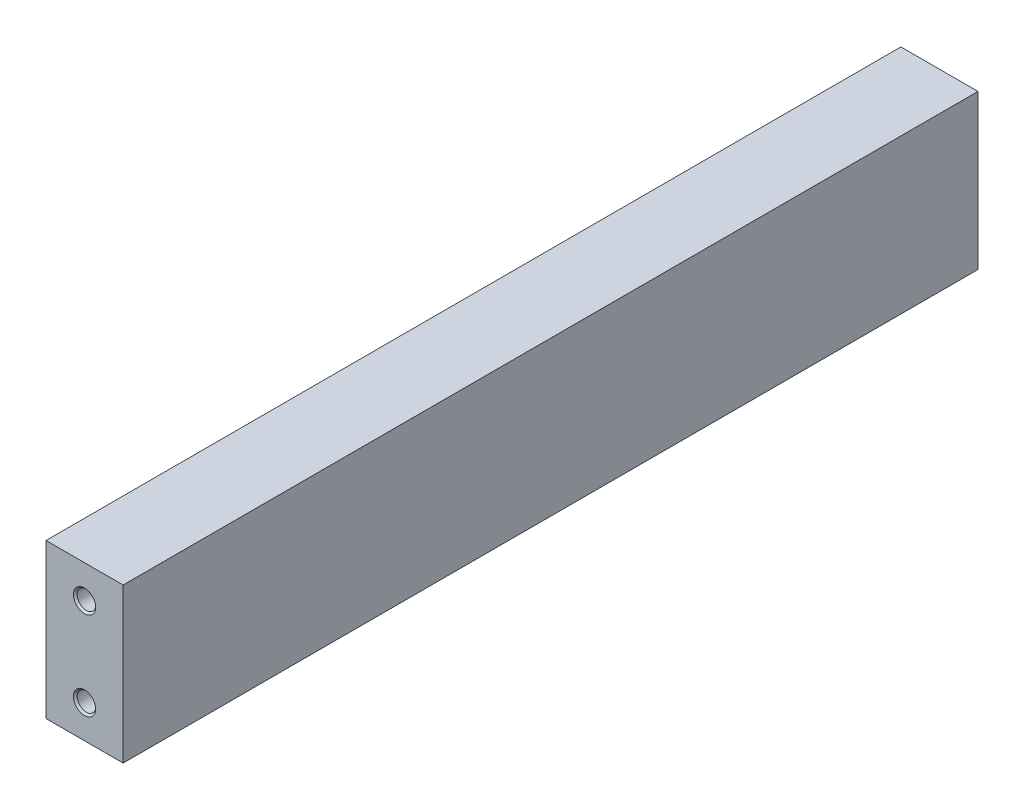
ISO-10303-21;
HEADER;
FILE_DESCRIPTION(('STEP AP214'),'2;1');
FILE_NAME('part.step','',(''),(''),'','','');
FILE_SCHEMA(('AUTOMOTIVE_DESIGN { 1 0 10303 214 1 1 1 1 }'));
ENDSEC;
DATA;
#1=APPLICATION_CONTEXT('core data for automotive mechanical design processes');
#2=APPLICATION_PROTOCOL_DEFINITION('international standard','automotive_design',2000,#1);
#3=PRODUCT_CONTEXT('',#1,'mechanical');
#4=PRODUCT('Part','Part','',(#3));
#5=PRODUCT_RELATED_PRODUCT_CATEGORY('part','',(#4));
#6=PRODUCT_DEFINITION_FORMATION('','',#4);
#7=PRODUCT_DEFINITION_CONTEXT('part definition',#1,'design');
#8=PRODUCT_DEFINITION('design','',#6,#7);
#9=PRODUCT_DEFINITION_SHAPE('','',#8);
#10=(LENGTH_UNIT() NAMED_UNIT(*) SI_UNIT(.MILLI.,.METRE.));
#11=(NAMED_UNIT(*) PLANE_ANGLE_UNIT() SI_UNIT($,.RADIAN.));
#12=(NAMED_UNIT(*) SI_UNIT($,.STERADIAN.) SOLID_ANGLE_UNIT());
#13=UNCERTAINTY_MEASURE_WITH_UNIT(LENGTH_MEASURE(1.E-05),#10,'distance_accuracy_value','');
#14=(GEOMETRIC_REPRESENTATION_CONTEXT(3) GLOBAL_UNCERTAINTY_ASSIGNED_CONTEXT((#13)) GLOBAL_UNIT_ASSIGNED_CONTEXT((#10,
#11,#12)) REPRESENTATION_CONTEXT('',''));
#15=CARTESIAN_POINT('',(0.,0.,0.));
#16=DIRECTION('',(0.,0.,1.));
#17=DIRECTION('',(1.,0.,0.));
#18=AXIS2_PLACEMENT_3D('',#15,#16,#17);
#19=CARTESIAN_POINT('',(8.75,-17.5,97.));
#20=DIRECTION('',(-1.,0.,0.));
#21=DIRECTION('',(0.,0.,1.));
#22=AXIS2_PLACEMENT_3D('',#19,#20,#21);
#23=PLANE('',#22);
#24=DIRECTION('',(0.,1.,0.));
#25=VECTOR('',#24,1.);
#26=CARTESIAN_POINT('',(8.75,-17.5,-97.));
#27=LINE('',#26,#25);
#28=CARTESIAN_POINT('',(8.75,-17.5,-97.));
#29=VERTEX_POINT('',#28);
#30=CARTESIAN_POINT('',(8.75,17.5,-97.));
#31=VERTEX_POINT('',#30);
#32=EDGE_CURVE('E161',#29,#31,#27,.T.);
#33=ORIENTED_EDGE('',*,*,#32,.T.);
#34=DIRECTION('',(0.,0.,-1.));
#35=VECTOR('',#34,1.);
#36=CARTESIAN_POINT('',(8.75,17.5,97.));
#37=LINE('',#36,#35);
#38=CARTESIAN_POINT('',(8.75,17.5,97.));
#39=VERTEX_POINT('',#38);
#40=EDGE_CURVE('E11',#39,#31,#37,.T.);
#41=ORIENTED_EDGE('',*,*,#40,.F.);
#42=DIRECTION('',(0.,1.,0.));
#43=VECTOR('',#42,1.);
#44=CARTESIAN_POINT('',(8.75,-17.5,97.));
#45=LINE('',#44,#43);
#46=CARTESIAN_POINT('',(8.75,-17.5,97.));
#47=VERTEX_POINT('',#46);
#48=EDGE_CURVE('E162',#47,#39,#45,.T.);
#49=ORIENTED_EDGE('',*,*,#48,.F.);
#50=DIRECTION('',(0.,0.,-1.));
#51=VECTOR('',#50,1.);
#52=CARTESIAN_POINT('',(8.75,-17.5,97.));
#53=LINE('',#52,#51);
#54=EDGE_CURVE('E172',#47,#29,#53,.T.);
#55=ORIENTED_EDGE('',*,*,#54,.T.);
#56=EDGE_LOOP('',(#33,#41,#49,#55));
#57=FACE_BOUND('',#56,.T.);
#58=ADVANCED_FACE('F45',(#57),#23,.F.);
#59=CARTESIAN_POINT('',(-8.75,17.5,97.));
#60=DIRECTION('',(0.,-1.,0.));
#61=DIRECTION('',(0.,0.,-1.));
#62=AXIS2_PLACEMENT_3D('',#59,#60,#61);
#63=PLANE('',#62);
#64=DIRECTION('',(-1.,0.,0.));
#65=VECTOR('',#64,1.);
#66=CARTESIAN_POINT('',(-8.75,17.5,-97.));
#67=LINE('',#66,#65);
#68=CARTESIAN_POINT('',(-8.75,17.5,-97.));
#69=VERTEX_POINT('',#68);
#70=EDGE_CURVE('E176',#31,#69,#67,.T.);
#71=ORIENTED_EDGE('',*,*,#70,.T.);
#72=DIRECTION('',(0.,0.,-1.));
#73=VECTOR('',#72,1.);
#74=CARTESIAN_POINT('',(-8.75,17.5,97.));
#75=LINE('',#74,#73);
#76=CARTESIAN_POINT('',(-8.75,17.5,97.));
#77=VERTEX_POINT('',#76);
#78=EDGE_CURVE('E54',#77,#69,#75,.T.);
#79=ORIENTED_EDGE('',*,*,#78,.F.);
#80=DIRECTION('',(-1.,0.,0.));
#81=VECTOR('',#80,1.);
#82=CARTESIAN_POINT('',(-8.75,17.5,97.));
#83=LINE('',#82,#81);
#84=EDGE_CURVE('E93',#39,#77,#83,.T.);
#85=ORIENTED_EDGE('',*,*,#84,.F.);
#86=ORIENTED_EDGE('',*,*,#40,.T.);
#87=EDGE_LOOP('',(#71,#79,#85,#86));
#88=FACE_BOUND('',#87,.T.);
#89=ADVANCED_FACE('F206',(#88),#63,.F.);
#90=CARTESIAN_POINT('',(-8.75,-17.5,97.));
#91=DIRECTION('',(1.,0.,0.));
#92=DIRECTION('',(0.,0.,-1.));
#93=AXIS2_PLACEMENT_3D('',#90,#91,#92);
#94=PLANE('',#93);
#95=DIRECTION('',(0.,-1.,0.));
#96=VECTOR('',#95,1.);
#97=CARTESIAN_POINT('',(-8.75,-17.5,-97.));
#98=LINE('',#97,#96);
#99=CARTESIAN_POINT('',(-8.75,-17.5,-97.));
#100=VERTEX_POINT('',#99);
#101=EDGE_CURVE('E80',#69,#100,#98,.T.);
#102=ORIENTED_EDGE('',*,*,#101,.T.);
#103=DIRECTION('',(0.,0.,-1.));
#104=VECTOR('',#103,1.);
#105=CARTESIAN_POINT('',(-8.75,-17.5,97.));
#106=LINE('',#105,#104);
#107=CARTESIAN_POINT('',(-8.75,-17.5,97.));
#108=VERTEX_POINT('',#107);
#109=EDGE_CURVE('E185',#108,#100,#106,.T.);
#110=ORIENTED_EDGE('',*,*,#109,.F.);
#111=DIRECTION('',(0.,-1.,0.));
#112=VECTOR('',#111,1.);
#113=CARTESIAN_POINT('',(-8.75,-17.5,97.));
#114=LINE('',#113,#112);
#115=EDGE_CURVE('E167',#77,#108,#114,.T.);
#116=ORIENTED_EDGE('',*,*,#115,.F.);
#117=ORIENTED_EDGE('',*,*,#78,.T.);
#118=EDGE_LOOP('',(#102,#110,#116,#117));
#119=FACE_BOUND('',#118,.T.);
#120=ADVANCED_FACE('F189',(#119),#94,.F.);
#121=CARTESIAN_POINT('',(-8.75,-17.5,97.));
#122=DIRECTION('',(0.,1.,0.));
#123=DIRECTION('',(0.,0.,1.));
#124=AXIS2_PLACEMENT_3D('',#121,#122,#123);
#125=PLANE('',#124);
#126=DIRECTION('',(1.,0.,0.));
#127=VECTOR('',#126,1.);
#128=CARTESIAN_POINT('',(-8.75,-17.5,-97.));
#129=LINE('',#128,#127);
#130=EDGE_CURVE('E86',#100,#29,#129,.T.);
#131=ORIENTED_EDGE('',*,*,#130,.T.);
#132=ORIENTED_EDGE('',*,*,#54,.F.);
#133=DIRECTION('',(1.,0.,0.));
#134=VECTOR('',#133,1.);
#135=CARTESIAN_POINT('',(-8.75,-17.5,97.));
#136=LINE('',#135,#134);
#137=EDGE_CURVE('E62',#108,#47,#136,.T.);
#138=ORIENTED_EDGE('',*,*,#137,.F.);
#139=ORIENTED_EDGE('',*,*,#109,.T.);
#140=EDGE_LOOP('',(#131,#132,#138,#139));
#141=FACE_BOUND('',#140,.T.);
#142=ADVANCED_FACE('F196',(#141),#125,.F.);
#143=CARTESIAN_POINT('',(0.,0.,97.));
#144=DIRECTION('',(0.,0.,-1.));
#145=DIRECTION('',(-1.,0.,0.));
#146=AXIS2_PLACEMENT_3D('',#143,#144,#145);
#147=PLANE('',#146);
#148=CARTESIAN_POINT('',(0.,10.,97.));
#149=DIRECTION('',(0.,0.,1.));
#150=DIRECTION('',(1.,0.,0.));
#151=AXIS2_PLACEMENT_3D('',#148,#149,#150);
#152=CIRCLE('',#151,2.525);
#153=CARTESIAN_POINT('',(2.525,10.,97.));
#154=VERTEX_POINT('',#153);
#155=EDGE_CURVE('E126',#154,#154,#152,.T.);
#156=ORIENTED_EDGE('',*,*,#155,.F.);
#157=EDGE_LOOP('',(#156));
#158=FACE_BOUND('',#157,.T.);
#159=CARTESIAN_POINT('',(0.,-10.,97.));
#160=DIRECTION('',(0.,0.,1.));
#161=DIRECTION('',(1.,0.,0.));
#162=AXIS2_PLACEMENT_3D('',#159,#160,#161);
#163=CIRCLE('',#162,2.525);
#164=CARTESIAN_POINT('',(2.525,-10.,97.));
#165=VERTEX_POINT('',#164);
#166=EDGE_CURVE('E117',#165,#165,#163,.T.);
#167=ORIENTED_EDGE('',*,*,#166,.F.);
#168=EDGE_LOOP('',(#167));
#169=FACE_BOUND('',#168,.T.);
#170=ORIENTED_EDGE('',*,*,#48,.T.);
#171=ORIENTED_EDGE('',*,*,#84,.T.);
#172=ORIENTED_EDGE('',*,*,#115,.T.);
#173=ORIENTED_EDGE('',*,*,#137,.T.);
#174=EDGE_LOOP('',(#170,#171,#172,#173));
#175=FACE_BOUND('',#174,.T.);
#176=ADVANCED_FACE('F198',(#158,#169,#175),#147,.F.);
#177=CARTESIAN_POINT('',(0.,0.,-97.));
#178=DIRECTION('',(0.,0.,-1.));
#179=DIRECTION('',(-1.,0.,0.));
#180=AXIS2_PLACEMENT_3D('',#177,#178,#179);
#181=PLANE('',#180);
#182=CARTESIAN_POINT('',(0.,10.,-97.));
#183=DIRECTION('',(0.,0.,-1.));
#184=DIRECTION('',(-1.,0.,0.));
#185=AXIS2_PLACEMENT_3D('',#182,#183,#184);
#186=CIRCLE('',#185,2.525);
#187=CARTESIAN_POINT('',(-2.525,10.,-97.));
#188=VERTEX_POINT('',#187);
#189=EDGE_CURVE('E137',#188,#188,#186,.T.);
#190=ORIENTED_EDGE('',*,*,#189,.F.);
#191=EDGE_LOOP('',(#190));
#192=FACE_BOUND('',#191,.T.);
#193=CARTESIAN_POINT('',(0.,-10.,-97.));
#194=DIRECTION('',(0.,0.,-1.));
#195=DIRECTION('',(-1.,0.,0.));
#196=AXIS2_PLACEMENT_3D('',#193,#194,#195);
#197=CIRCLE('',#196,2.525);
#198=CARTESIAN_POINT('',(-2.525,-10.,-97.));
#199=VERTEX_POINT('',#198);
#200=EDGE_CURVE('E149',#199,#199,#197,.T.);
#201=ORIENTED_EDGE('',*,*,#200,.F.);
#202=EDGE_LOOP('',(#201));
#203=FACE_BOUND('',#202,.T.);
#204=ORIENTED_EDGE('',*,*,#32,.F.);
#205=ORIENTED_EDGE('',*,*,#130,.F.);
#206=ORIENTED_EDGE('',*,*,#101,.F.);
#207=ORIENTED_EDGE('',*,*,#70,.F.);
#208=EDGE_LOOP('',(#204,#205,#206,#207));
#209=FACE_BOUND('',#208,.T.);
#210=ADVANCED_FACE('F192',(#192,#203,#209),#181,.T.);
#211=CARTESIAN_POINT('',(0.,-10.,-83.));
#212=DIRECTION('',(0.,0.,-1.));
#213=DIRECTION('',(-1.,0.,0.));
#214=AXIS2_PLACEMENT_3D('',#211,#212,#213);
#215=CONICAL_SURFACE('',#214,2.09999999999997,1.02974425867665);
#216=CARTESIAN_POINT('',(0.,-10.,-81.7381927000421));
#217=VERTEX_POINT('',#216);
#218=VERTEX_LOOP('',#217);
#219=FACE_BOUND('',#218,.T.);
#220=CARTESIAN_POINT('',(0.,-10.,-83.));
#221=DIRECTION('',(0.,0.,-1.));
#222=DIRECTION('',(-1.,0.,0.));
#223=AXIS2_PLACEMENT_3D('',#220,#221,#222);
#224=CIRCLE('',#223,2.09999999999997);
#225=CARTESIAN_POINT('',(-2.09999999999997,-10.,-83.));
#226=VERTEX_POINT('',#225);
#227=EDGE_CURVE('E157',#226,#226,#224,.T.);
#228=ORIENTED_EDGE('',*,*,#227,.T.);
#229=EDGE_LOOP('',(#228));
#230=FACE_BOUND('',#229,.T.);
#231=ADVANCED_FACE('F234',(#219,#230),#215,.F.);
#232=CARTESIAN_POINT('',(0.,-10.,-97.));
#233=DIRECTION('',(0.,0.,-1.));
#234=DIRECTION('',(-1.,0.,0.));
#235=AXIS2_PLACEMENT_3D('',#232,#233,#234);
#236=CYLINDRICAL_SURFACE('',#235,2.09999999999998);
#237=ORIENTED_EDGE('',*,*,#227,.F.);
#238=EDGE_LOOP('',(#237));
#239=FACE_BOUND('',#238,.T.);
#240=CARTESIAN_POINT('',(0.,-10.,-96.575));
#241=DIRECTION('',(0.,0.,-1.));
#242=DIRECTION('',(-1.,0.,0.));
#243=AXIS2_PLACEMENT_3D('',#240,#241,#242);
#244=CIRCLE('',#243,2.09999999999998);
#245=CARTESIAN_POINT('',(-2.09999999999998,-10.,-96.575));
#246=VERTEX_POINT('',#245);
#247=EDGE_CURVE('E153',#246,#246,#244,.T.);
#248=ORIENTED_EDGE('',*,*,#247,.T.);
#249=EDGE_LOOP('',(#248));
#250=FACE_BOUND('',#249,.T.);
#251=ADVANCED_FACE('F246',(#239,#250),#236,.F.);
#252=CARTESIAN_POINT('',(0.,-10.,-97.));
#253=DIRECTION('',(0.,0.,-1.));
#254=DIRECTION('',(-1.,0.,0.));
#255=AXIS2_PLACEMENT_3D('',#252,#253,#254);
#256=CONICAL_SURFACE('',#255,2.525,0.785398163397466);
#257=ORIENTED_EDGE('',*,*,#247,.F.);
#258=EDGE_LOOP('',(#257));
#259=FACE_BOUND('',#258,.T.);
#260=ORIENTED_EDGE('',*,*,#200,.T.);
#261=EDGE_LOOP('',(#260));
#262=FACE_BOUND('',#261,.T.);
#263=ADVANCED_FACE('F257',(#259,#262),#256,.F.);
#264=CARTESIAN_POINT('',(0.,10.,-83.));
#265=DIRECTION('',(0.,0.,-1.));
#266=DIRECTION('',(-1.,0.,0.));
#267=AXIS2_PLACEMENT_3D('',#264,#265,#266);
#268=CONICAL_SURFACE('',#267,2.09999999999997,1.02974425867665);
#269=CARTESIAN_POINT('',(0.,10.,-81.7381927000421));
#270=VERTEX_POINT('',#269);
#271=VERTEX_LOOP('',#270);
#272=FACE_BOUND('',#271,.T.);
#273=CARTESIAN_POINT('',(0.,10.,-83.));
#274=DIRECTION('',(0.,0.,-1.));
#275=DIRECTION('',(-1.,0.,0.));
#276=AXIS2_PLACEMENT_3D('',#273,#274,#275);
#277=CIRCLE('',#276,2.09999999999997);
#278=CARTESIAN_POINT('',(-2.09999999999997,10.,-83.));
#279=VERTEX_POINT('',#278);
#280=EDGE_CURVE('E145',#279,#279,#277,.T.);
#281=ORIENTED_EDGE('',*,*,#280,.T.);
#282=EDGE_LOOP('',(#281));
#283=FACE_BOUND('',#282,.T.);
#284=ADVANCED_FACE('F269',(#272,#283),#268,.F.);
#285=CARTESIAN_POINT('',(0.,10.,-97.));
#286=DIRECTION('',(0.,0.,-1.));
#287=DIRECTION('',(-1.,0.,0.));
#288=AXIS2_PLACEMENT_3D('',#285,#286,#287);
#289=CYLINDRICAL_SURFACE('',#288,2.09999999999998);
#290=ORIENTED_EDGE('',*,*,#280,.F.);
#291=EDGE_LOOP('',(#290));
#292=FACE_BOUND('',#291,.T.);
#293=CARTESIAN_POINT('',(0.,10.,-96.575));
#294=DIRECTION('',(0.,0.,-1.));
#295=DIRECTION('',(-1.,0.,0.));
#296=AXIS2_PLACEMENT_3D('',#293,#294,#295);
#297=CIRCLE('',#296,2.09999999999998);
#298=CARTESIAN_POINT('',(-2.09999999999997,10.,-96.575));
#299=VERTEX_POINT('',#298);
#300=EDGE_CURVE('E141',#299,#299,#297,.T.);
#301=ORIENTED_EDGE('',*,*,#300,.T.);
#302=EDGE_LOOP('',(#301));
#303=FACE_BOUND('',#302,.T.);
#304=ADVANCED_FACE('F279',(#292,#303),#289,.F.);
#305=CARTESIAN_POINT('',(0.,10.,-97.));
#306=DIRECTION('',(0.,0.,-1.));
#307=DIRECTION('',(-1.,0.,0.));
#308=AXIS2_PLACEMENT_3D('',#305,#306,#307);
#309=CONICAL_SURFACE('',#308,2.525,0.785398163397466);
#310=ORIENTED_EDGE('',*,*,#300,.F.);
#311=EDGE_LOOP('',(#310));
#312=FACE_BOUND('',#311,.T.);
#313=ORIENTED_EDGE('',*,*,#189,.T.);
#314=EDGE_LOOP('',(#313));
#315=FACE_BOUND('',#314,.T.);
#316=ADVANCED_FACE('F289',(#312,#315),#309,.F.);
#317=CARTESIAN_POINT('',(0.,-10.,83.));
#318=DIRECTION('',(0.,0.,1.));
#319=DIRECTION('',(1.,0.,0.));
#320=AXIS2_PLACEMENT_3D('',#317,#318,#319);
#321=CONICAL_SURFACE('',#320,2.09999999999997,1.02974425867665);
#322=CARTESIAN_POINT('',(0.,-10.,81.7381927000421));
#323=VERTEX_POINT('',#322);
#324=VERTEX_LOOP('',#323);
#325=FACE_BOUND('',#324,.T.);
#326=CARTESIAN_POINT('',(0.,-10.,83.));
#327=DIRECTION('',(0.,0.,1.));
#328=DIRECTION('',(1.,0.,0.));
#329=AXIS2_PLACEMENT_3D('',#326,#327,#328);
#330=CIRCLE('',#329,2.09999999999997);
#331=CARTESIAN_POINT('',(2.09999999999997,-10.,83.));
#332=VERTEX_POINT('',#331);
#333=EDGE_CURVE('E133',#332,#332,#330,.T.);
#334=ORIENTED_EDGE('',*,*,#333,.T.);
#335=EDGE_LOOP('',(#334));
#336=FACE_BOUND('',#335,.T.);
#337=ADVANCED_FACE('F301',(#325,#336),#321,.F.);
#338=CARTESIAN_POINT('',(0.,-10.,97.));
#339=DIRECTION('',(0.,0.,1.));
#340=DIRECTION('',(1.,0.,0.));
#341=AXIS2_PLACEMENT_3D('',#338,#339,#340);
#342=CYLINDRICAL_SURFACE('',#341,2.09999999999998);
#343=ORIENTED_EDGE('',*,*,#333,.F.);
#344=EDGE_LOOP('',(#343));
#345=FACE_BOUND('',#344,.T.);
#346=CARTESIAN_POINT('',(0.,-10.,96.575));
#347=DIRECTION('',(0.,0.,1.));
#348=DIRECTION('',(1.,0.,0.));
#349=AXIS2_PLACEMENT_3D('',#346,#347,#348);
#350=CIRCLE('',#349,2.09999999999998);
#351=CARTESIAN_POINT('',(2.09999999999998,-10.,96.575));
#352=VERTEX_POINT('',#351);
#353=EDGE_CURVE('E123',#352,#352,#350,.T.);
#354=ORIENTED_EDGE('',*,*,#353,.T.);
#355=EDGE_LOOP('',(#354));
#356=FACE_BOUND('',#355,.T.);
#357=ADVANCED_FACE('F320',(#345,#356),#342,.F.);
#358=CARTESIAN_POINT('',(0.,-10.,97.));
#359=DIRECTION('',(0.,0.,1.));
#360=DIRECTION('',(1.,0.,0.));
#361=AXIS2_PLACEMENT_3D('',#358,#359,#360);
#362=CONICAL_SURFACE('',#361,2.525,0.785398163397466);
#363=ORIENTED_EDGE('',*,*,#353,.F.);
#364=EDGE_LOOP('',(#363));
#365=FACE_BOUND('',#364,.T.);
#366=ORIENTED_EDGE('',*,*,#166,.T.);
#367=EDGE_LOOP('',(#366));
#368=FACE_BOUND('',#367,.T.);
#369=ADVANCED_FACE('F110',(#365,#368),#362,.F.);
#370=CARTESIAN_POINT('',(0.,10.,83.));
#371=DIRECTION('',(0.,0.,1.));
#372=DIRECTION('',(1.,0.,0.));
#373=AXIS2_PLACEMENT_3D('',#370,#371,#372);
#374=CONICAL_SURFACE('',#373,2.09999999999997,1.02974425867665);
#375=CARTESIAN_POINT('',(0.,10.,81.7381927000421));
#376=VERTEX_POINT('',#375);
#377=VERTEX_LOOP('',#376);
#378=FACE_BOUND('',#377,.T.);
#379=CARTESIAN_POINT('',(0.,10.,83.));
#380=DIRECTION('',(0.,0.,1.));
#381=DIRECTION('',(1.,0.,0.));
#382=AXIS2_PLACEMENT_3D('',#379,#380,#381);
#383=CIRCLE('',#382,2.09999999999997);
#384=CARTESIAN_POINT('',(2.09999999999998,10.,83.));
#385=VERTEX_POINT('',#384);
#386=EDGE_CURVE('E114',#385,#385,#383,.T.);
#387=ORIENTED_EDGE('',*,*,#386,.T.);
#388=EDGE_LOOP('',(#387));
#389=FACE_BOUND('',#388,.T.);
#390=ADVANCED_FACE('F106',(#378,#389),#374,.F.);
#391=CARTESIAN_POINT('',(0.,10.,97.));
#392=DIRECTION('',(0.,0.,1.));
#393=DIRECTION('',(1.,0.,0.));
#394=AXIS2_PLACEMENT_3D('',#391,#392,#393);
#395=CYLINDRICAL_SURFACE('',#394,2.09999999999998);
#396=ORIENTED_EDGE('',*,*,#386,.F.);
#397=EDGE_LOOP('',(#396));
#398=FACE_BOUND('',#397,.T.);
#399=CARTESIAN_POINT('',(0.,10.,96.575));
#400=DIRECTION('',(0.,0.,1.));
#401=DIRECTION('',(1.,0.,0.));
#402=AXIS2_PLACEMENT_3D('',#399,#400,#401);
#403=CIRCLE('',#402,2.09999999999998);
#404=CARTESIAN_POINT('',(2.09999999999998,10.,96.575));
#405=VERTEX_POINT('',#404);
#406=EDGE_CURVE('E118',#405,#405,#403,.T.);
#407=ORIENTED_EDGE('',*,*,#406,.T.);
#408=EDGE_LOOP('',(#407));
#409=FACE_BOUND('',#408,.T.);
#410=ADVANCED_FACE('F109',(#398,#409),#395,.F.);
#411=CARTESIAN_POINT('',(0.,10.,97.));
#412=DIRECTION('',(0.,0.,1.));
#413=DIRECTION('',(1.,0.,0.));
#414=AXIS2_PLACEMENT_3D('',#411,#412,#413);
#415=CONICAL_SURFACE('',#414,2.525,0.785398163397466);
#416=ORIENTED_EDGE('',*,*,#406,.F.);
#417=EDGE_LOOP('',(#416));
#418=FACE_BOUND('',#417,.T.);
#419=ORIENTED_EDGE('',*,*,#155,.T.);
#420=EDGE_LOOP('',(#419));
#421=FACE_BOUND('',#420,.T.);
#422=ADVANCED_FACE('F358',(#418,#421),#415,.F.);
#423=CLOSED_SHELL('',(#58,#89,#120,#142,#176,#210,#231,#251,#263,#284,#304,#316,#337,#357,#369,
#390,#410,#422));
#424=MANIFOLD_SOLID_BREP('B2',#423);
#425=ADVANCED_BREP_SHAPE_REPRESENTATION('',(#18,#424),#14);
#426=SHAPE_DEFINITION_REPRESENTATION(#9,#425);
ENDSEC;
END-ISO-10303-21;
